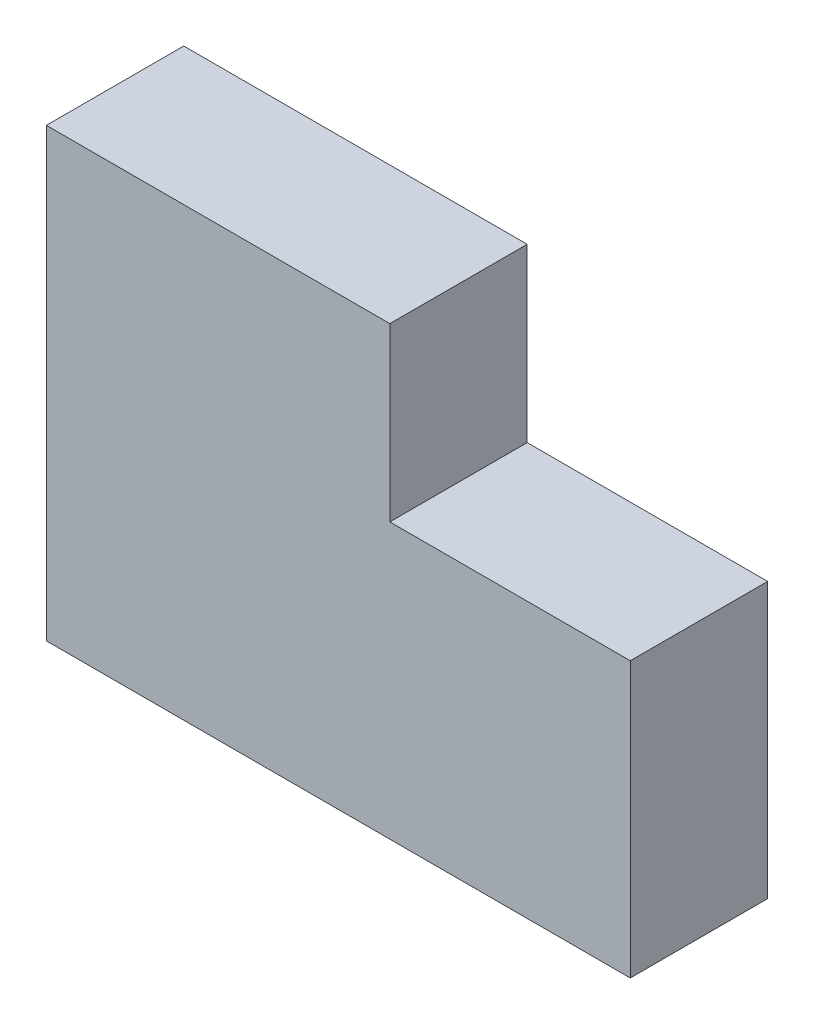
ISO-10303-21;
HEADER;
FILE_DESCRIPTION(('STEP AP214'),'2;1');
FILE_NAME('part.step','',(''),(''),'','','');
FILE_SCHEMA(('AUTOMOTIVE_DESIGN { 1 0 10303 214 1 1 1 1 }'));
ENDSEC;
DATA;
#1=APPLICATION_CONTEXT('core data for automotive mechanical design processes');
#2=APPLICATION_PROTOCOL_DEFINITION('international standard','automotive_design',2000,#1);
#3=PRODUCT_CONTEXT('',#1,'mechanical');
#4=PRODUCT('Part','Part','',(#3));
#5=PRODUCT_RELATED_PRODUCT_CATEGORY('part','',(#4));
#6=PRODUCT_DEFINITION_FORMATION('','',#4);
#7=PRODUCT_DEFINITION_CONTEXT('part definition',#1,'design');
#8=PRODUCT_DEFINITION('design','',#6,#7);
#9=PRODUCT_DEFINITION_SHAPE('','',#8);
#10=(LENGTH_UNIT() NAMED_UNIT(*) SI_UNIT(.MILLI.,.METRE.));
#11=(NAMED_UNIT(*) PLANE_ANGLE_UNIT() SI_UNIT($,.RADIAN.));
#12=(NAMED_UNIT(*) SI_UNIT($,.STERADIAN.) SOLID_ANGLE_UNIT());
#13=UNCERTAINTY_MEASURE_WITH_UNIT(LENGTH_MEASURE(1.E-05),#10,'distance_accuracy_value','');
#14=(GEOMETRIC_REPRESENTATION_CONTEXT(3) GLOBAL_UNCERTAINTY_ASSIGNED_CONTEXT((#13)) GLOBAL_UNIT_ASSIGNED_CONTEXT((#10,
#11,#12)) REPRESENTATION_CONTEXT('',''));
#15=CARTESIAN_POINT('',(0.,0.,0.));
#16=DIRECTION('',(0.,0.,1.));
#17=DIRECTION('',(1.,0.,0.));
#18=AXIS2_PLACEMENT_3D('',#15,#16,#17);
#19=CARTESIAN_POINT('',(50.,65.,20.));
#20=DIRECTION('',(0.,-1.,0.));
#21=DIRECTION('',(0.,0.,-1.));
#22=AXIS2_PLACEMENT_3D('',#19,#20,#21);
#23=PLANE('',#22);
#24=DIRECTION('',(-1.,0.,0.));
#25=VECTOR('',#24,1.);
#26=CARTESIAN_POINT('',(50.,65.,0.));
#27=LINE('',#26,#25);
#28=CARTESIAN_POINT('',(50.,65.,0.));
#29=VERTEX_POINT('',#28);
#30=CARTESIAN_POINT('',(0.,65.,0.));
#31=VERTEX_POINT('',#30);
#32=EDGE_CURVE('E128',#29,#31,#27,.T.);
#33=ORIENTED_EDGE('',*,*,#32,.T.);
#34=DIRECTION('',(0.,0.,-1.));
#35=VECTOR('',#34,1.);
#36=CARTESIAN_POINT('',(0.,65.,20.));
#37=LINE('',#36,#35);
#38=CARTESIAN_POINT('',(0.,65.,20.));
#39=VERTEX_POINT('',#38);
#40=EDGE_CURVE('E11',#39,#31,#37,.T.);
#41=ORIENTED_EDGE('',*,*,#40,.F.);
#42=DIRECTION('',(-1.,0.,0.));
#43=VECTOR('',#42,1.);
#44=CARTESIAN_POINT('',(50.,65.,20.));
#45=LINE('',#44,#43);
#46=CARTESIAN_POINT('',(50.,65.,20.));
#47=VERTEX_POINT('',#46);
#48=EDGE_CURVE('E144',#47,#39,#45,.T.);
#49=ORIENTED_EDGE('',*,*,#48,.F.);
#50=DIRECTION('',(0.,0.,-1.));
#51=VECTOR('',#50,1.);
#52=CARTESIAN_POINT('',(50.,65.,20.));
#53=LINE('',#52,#51);
#54=EDGE_CURVE('E124',#47,#29,#53,.T.);
#55=ORIENTED_EDGE('',*,*,#54,.T.);
#56=EDGE_LOOP('',(#33,#41,#49,#55));
#57=FACE_BOUND('',#56,.T.);
#58=ADVANCED_FACE('F39',(#57),#23,.F.);
#59=CARTESIAN_POINT('',(0.,65.,20.));
#60=DIRECTION('',(1.,0.,0.));
#61=DIRECTION('',(0.,1.,0.));
#62=AXIS2_PLACEMENT_3D('',#59,#60,#61);
#63=PLANE('',#62);
#64=DIRECTION('',(0.,-1.,0.));
#65=VECTOR('',#64,1.);
#66=CARTESIAN_POINT('',(0.,65.,0.));
#67=LINE('',#66,#65);
#68=CARTESIAN_POINT('',(0.,0.,0.));
#69=VERTEX_POINT('',#68);
#70=EDGE_CURVE('E132',#31,#69,#67,.T.);
#71=ORIENTED_EDGE('',*,*,#70,.T.);
#72=DIRECTION('',(0.,0.,-1.));
#73=VECTOR('',#72,1.);
#74=CARTESIAN_POINT('',(0.,0.,20.));
#75=LINE('',#74,#73);
#76=CARTESIAN_POINT('',(0.,0.,20.));
#77=VERTEX_POINT('',#76);
#78=EDGE_CURVE('E48',#77,#69,#75,.T.);
#79=ORIENTED_EDGE('',*,*,#78,.F.);
#80=DIRECTION('',(0.,-1.,0.));
#81=VECTOR('',#80,1.);
#82=CARTESIAN_POINT('',(0.,65.,20.));
#83=LINE('',#82,#81);
#84=EDGE_CURVE('E93',#39,#77,#83,.T.);
#85=ORIENTED_EDGE('',*,*,#84,.F.);
#86=ORIENTED_EDGE('',*,*,#40,.T.);
#87=EDGE_LOOP('',(#71,#79,#85,#86));
#88=FACE_BOUND('',#87,.T.);
#89=ADVANCED_FACE('F172',(#88),#63,.F.);
#90=CARTESIAN_POINT('',(0.,0.,20.));
#91=DIRECTION('',(0.,1.,0.));
#92=DIRECTION('',(0.,0.,1.));
#93=AXIS2_PLACEMENT_3D('',#90,#91,#92);
#94=PLANE('',#93);
#95=DIRECTION('',(1.,0.,0.));
#96=VECTOR('',#95,1.);
#97=CARTESIAN_POINT('',(0.,0.,0.));
#98=LINE('',#97,#96);
#99=CARTESIAN_POINT('',(85.,0.,0.));
#100=VERTEX_POINT('',#99);
#101=EDGE_CURVE('E135',#69,#100,#98,.T.);
#102=ORIENTED_EDGE('',*,*,#101,.T.);
#103=DIRECTION('',(0.,0.,-1.));
#104=VECTOR('',#103,1.);
#105=CARTESIAN_POINT('',(85.,0.,20.));
#106=LINE('',#105,#104);
#107=CARTESIAN_POINT('',(85.,0.,20.));
#108=VERTEX_POINT('',#107);
#109=EDGE_CURVE('E117',#108,#100,#106,.T.);
#110=ORIENTED_EDGE('',*,*,#109,.F.);
#111=DIRECTION('',(1.,0.,0.));
#112=VECTOR('',#111,1.);
#113=CARTESIAN_POINT('',(0.,0.,20.));
#114=LINE('',#113,#112);
#115=EDGE_CURVE('E106',#77,#108,#114,.T.);
#116=ORIENTED_EDGE('',*,*,#115,.F.);
#117=ORIENTED_EDGE('',*,*,#78,.T.);
#118=EDGE_LOOP('',(#102,#110,#116,#117));
#119=FACE_BOUND('',#118,.T.);
#120=ADVANCED_FACE('F154',(#119),#94,.F.);
#121=CARTESIAN_POINT('',(85.,0.,20.));
#122=DIRECTION('',(-1.,0.,0.));
#123=DIRECTION('',(0.,0.,1.));
#124=AXIS2_PLACEMENT_3D('',#121,#122,#123);
#125=PLANE('',#124);
#126=DIRECTION('',(0.,1.,0.));
#127=VECTOR('',#126,1.);
#128=CARTESIAN_POINT('',(85.,0.,0.));
#129=LINE('',#128,#127);
#130=CARTESIAN_POINT('',(85.,40.,0.));
#131=VERTEX_POINT('',#130);
#132=EDGE_CURVE('E115',#100,#131,#129,.T.);
#133=ORIENTED_EDGE('',*,*,#132,.T.);
#134=DIRECTION('',(0.,0.,-1.));
#135=VECTOR('',#134,1.);
#136=CARTESIAN_POINT('',(85.,40.,20.));
#137=LINE('',#136,#135);
#138=CARTESIAN_POINT('',(85.,40.,20.));
#139=VERTEX_POINT('',#138);
#140=EDGE_CURVE('E112',#139,#131,#137,.T.);
#141=ORIENTED_EDGE('',*,*,#140,.F.);
#142=DIRECTION('',(0.,1.,0.));
#143=VECTOR('',#142,1.);
#144=CARTESIAN_POINT('',(85.,0.,20.));
#145=LINE('',#144,#143);
#146=EDGE_CURVE('E100',#108,#139,#145,.T.);
#147=ORIENTED_EDGE('',*,*,#146,.F.);
#148=ORIENTED_EDGE('',*,*,#109,.T.);
#149=EDGE_LOOP('',(#133,#141,#147,#148));
#150=FACE_BOUND('',#149,.T.);
#151=ADVANCED_FACE('F113',(#150),#125,.F.);
#152=CARTESIAN_POINT('',(85.,40.,20.));
#153=DIRECTION('',(0.,-1.,0.));
#154=DIRECTION('',(1.,0.,0.));
#155=AXIS2_PLACEMENT_3D('',#152,#153,#154);
#156=PLANE('',#155);
#157=DIRECTION('',(-1.,0.,0.));
#158=VECTOR('',#157,1.);
#159=CARTESIAN_POINT('',(85.,40.,0.));
#160=LINE('',#159,#158);
#161=CARTESIAN_POINT('',(50.,40.,0.));
#162=VERTEX_POINT('',#161);
#163=EDGE_CURVE('E79',#131,#162,#160,.T.);
#164=ORIENTED_EDGE('',*,*,#163,.T.);
#165=DIRECTION('',(0.,0.,-1.));
#166=VECTOR('',#165,1.);
#167=CARTESIAN_POINT('',(50.,40.,20.));
#168=LINE('',#167,#166);
#169=CARTESIAN_POINT('',(50.,40.,20.));
#170=VERTEX_POINT('',#169);
#171=EDGE_CURVE('E118',#170,#162,#168,.T.);
#172=ORIENTED_EDGE('',*,*,#171,.F.);
#173=DIRECTION('',(-1.,0.,0.));
#174=VECTOR('',#173,1.);
#175=CARTESIAN_POINT('',(85.,40.,20.));
#176=LINE('',#175,#174);
#177=EDGE_CURVE('E104',#139,#170,#176,.T.);
#178=ORIENTED_EDGE('',*,*,#177,.F.);
#179=ORIENTED_EDGE('',*,*,#140,.T.);
#180=EDGE_LOOP('',(#164,#172,#178,#179));
#181=FACE_BOUND('',#180,.T.);
#182=ADVANCED_FACE('F120',(#181),#156,.F.);
#183=CARTESIAN_POINT('',(50.,40.,20.));
#184=DIRECTION('',(-1.,0.,0.));
#185=DIRECTION('',(0.,0.,1.));
#186=AXIS2_PLACEMENT_3D('',#183,#184,#185);
#187=PLANE('',#186);
#188=DIRECTION('',(0.,1.,0.));
#189=VECTOR('',#188,1.);
#190=CARTESIAN_POINT('',(50.,40.,0.));
#191=LINE('',#190,#189);
#192=EDGE_CURVE('E85',#162,#29,#191,.T.);
#193=ORIENTED_EDGE('',*,*,#192,.T.);
#194=ORIENTED_EDGE('',*,*,#54,.F.);
#195=DIRECTION('',(0.,1.,0.));
#196=VECTOR('',#195,1.);
#197=CARTESIAN_POINT('',(50.,40.,20.));
#198=LINE('',#197,#196);
#199=EDGE_CURVE('E56',#170,#47,#198,.T.);
#200=ORIENTED_EDGE('',*,*,#199,.F.);
#201=ORIENTED_EDGE('',*,*,#171,.T.);
#202=EDGE_LOOP('',(#193,#194,#200,#201));
#203=FACE_BOUND('',#202,.T.);
#204=ADVANCED_FACE('F161',(#203),#187,.F.);
#205=CARTESIAN_POINT('',(0.,0.,20.));
#206=DIRECTION('',(0.,0.,1.));
#207=DIRECTION('',(1.,0.,0.));
#208=AXIS2_PLACEMENT_3D('',#205,#206,#207);
#209=PLANE('',#208);
#210=ORIENTED_EDGE('',*,*,#48,.T.);
#211=ORIENTED_EDGE('',*,*,#84,.T.);
#212=ORIENTED_EDGE('',*,*,#115,.T.);
#213=ORIENTED_EDGE('',*,*,#146,.T.);
#214=ORIENTED_EDGE('',*,*,#177,.T.);
#215=ORIENTED_EDGE('',*,*,#199,.T.);
#216=EDGE_LOOP('',(#210,#211,#212,#213,#214,#215));
#217=FACE_BOUND('',#216,.T.);
#218=ADVANCED_FACE('F102',(#217),#209,.T.);
#219=CARTESIAN_POINT('',(0.,0.,0.));
#220=DIRECTION('',(0.,0.,1.));
#221=DIRECTION('',(1.,0.,0.));
#222=AXIS2_PLACEMENT_3D('',#219,#220,#221);
#223=PLANE('',#222);
#224=ORIENTED_EDGE('',*,*,#32,.F.);
#225=ORIENTED_EDGE('',*,*,#192,.F.);
#226=ORIENTED_EDGE('',*,*,#163,.F.);
#227=ORIENTED_EDGE('',*,*,#132,.F.);
#228=ORIENTED_EDGE('',*,*,#101,.F.);
#229=ORIENTED_EDGE('',*,*,#70,.F.);
#230=EDGE_LOOP('',(#224,#225,#226,#227,#228,#229));
#231=FACE_BOUND('',#230,.T.);
#232=ADVANCED_FACE('F157',(#231),#223,.F.);
#233=CLOSED_SHELL('',(#58,#89,#120,#151,#182,#204,#218,#232));
#234=MANIFOLD_SOLID_BREP('B2',#233);
#235=ADVANCED_BREP_SHAPE_REPRESENTATION('',(#18,#234),#14);
#236=SHAPE_DEFINITION_REPRESENTATION(#9,#235);
ENDSEC;
END-ISO-10303-21;
